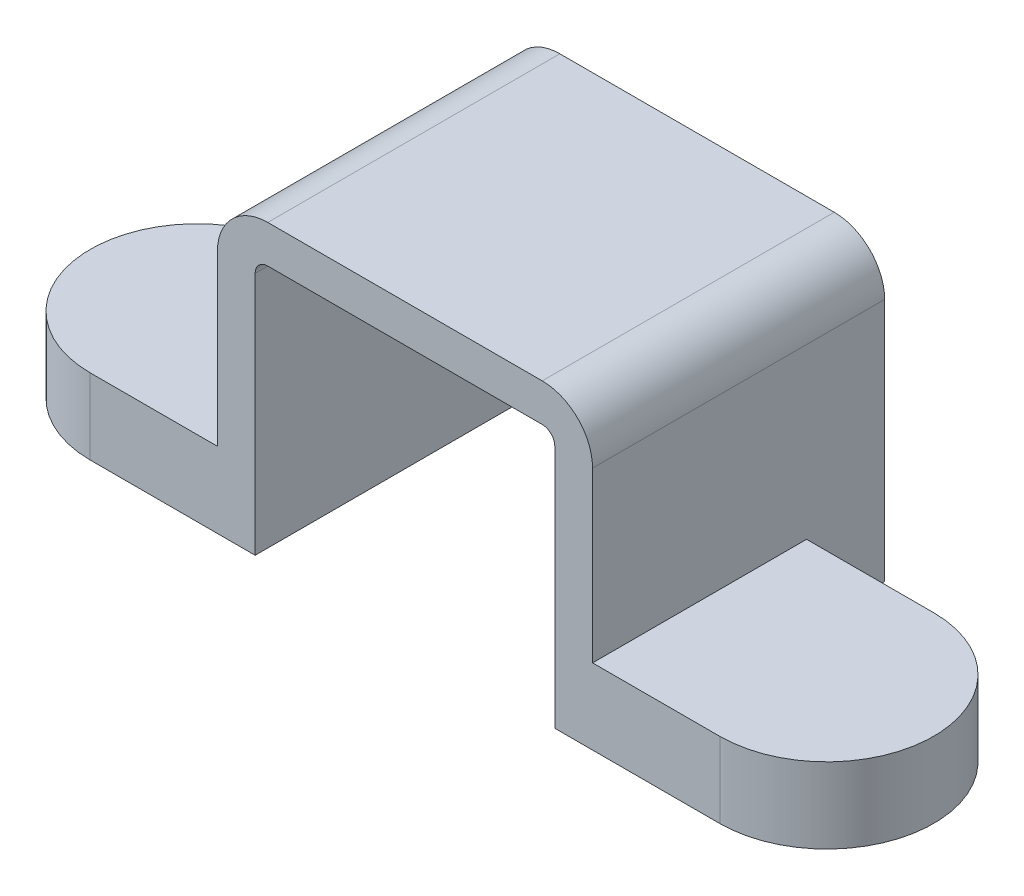
ISO-10303-21;
HEADER;
FILE_DESCRIPTION(('STEP AP214'),'2;1');
FILE_NAME('part.step','',(''),(''),'','','');
FILE_SCHEMA(('AUTOMOTIVE_DESIGN { 1 0 10303 214 1 1 1 1 }'));
ENDSEC;
DATA;
#1=APPLICATION_CONTEXT('core data for automotive mechanical design processes');
#2=APPLICATION_PROTOCOL_DEFINITION('international standard','automotive_design',2000,#1);
#3=PRODUCT_CONTEXT('',#1,'mechanical');
#4=PRODUCT('Part','Part','',(#3));
#5=PRODUCT_RELATED_PRODUCT_CATEGORY('part','',(#4));
#6=PRODUCT_DEFINITION_FORMATION('','',#4);
#7=PRODUCT_DEFINITION_CONTEXT('part definition',#1,'design');
#8=PRODUCT_DEFINITION('design','',#6,#7);
#9=PRODUCT_DEFINITION_SHAPE('','',#8);
#10=(LENGTH_UNIT() NAMED_UNIT(*) SI_UNIT(.MILLI.,.METRE.));
#11=(NAMED_UNIT(*) PLANE_ANGLE_UNIT() SI_UNIT($,.RADIAN.));
#12=(NAMED_UNIT(*) SI_UNIT($,.STERADIAN.) SOLID_ANGLE_UNIT());
#13=UNCERTAINTY_MEASURE_WITH_UNIT(LENGTH_MEASURE(1.E-05),#10,'distance_accuracy_value','');
#14=(GEOMETRIC_REPRESENTATION_CONTEXT(3) GLOBAL_UNCERTAINTY_ASSIGNED_CONTEXT((#13)) GLOBAL_UNIT_ASSIGNED_CONTEXT((#10,
#11,#12)) REPRESENTATION_CONTEXT('',''));
#15=CARTESIAN_POINT('',(0.,0.,0.));
#16=DIRECTION('',(0.,0.,1.));
#17=DIRECTION('',(1.,0.,0.));
#18=AXIS2_PLACEMENT_3D('',#15,#16,#17);
#19=CARTESIAN_POINT('',(7.45,0.,3.10000190177653));
#20=DIRECTION('',(0.,0.,1.));
#21=DIRECTION('',(1.,0.,0.));
#22=AXIS2_PLACEMENT_3D('',#19,#20,#21);
#23=PLANE('',#22);
#24=DIRECTION('',(0.,1.,0.));
#25=VECTOR('',#24,1.);
#26=CARTESIAN_POINT('',(7.45,0.,3.10000190177653));
#27=LINE('',#26,#25);
#28=CARTESIAN_POINT('',(7.45,3.,3.10000190177653));
#29=VERTEX_POINT('',#28);
#30=CARTESIAN_POINT('',(7.45,0.,3.10000190177653));
#31=VERTEX_POINT('',#30);
#32=EDGE_CURVE('E153',#29,#31,#27,.F.);
#33=ORIENTED_EDGE('',*,*,#32,.F.);
#34=DIRECTION('',(1.,0.,0.));
#35=VECTOR('',#34,1.);
#36=CARTESIAN_POINT('',(12.1,3.,3.10000190177653));
#37=LINE('',#36,#35);
#38=CARTESIAN_POINT('',(12.5,3.,3.10000190177653));
#39=VERTEX_POINT('',#38);
#40=EDGE_CURVE('E148',#39,#29,#37,.F.);
#41=ORIENTED_EDGE('',*,*,#40,.F.);
#42=DIRECTION('',(0.,-1.,0.));
#43=VECTOR('',#42,1.);
#44=CARTESIAN_POINT('',(12.5,0.,3.10000190177653));
#45=LINE('',#44,#43);
#46=CARTESIAN_POINT('',(12.5,0.,3.10000190177653));
#47=VERTEX_POINT('',#46);
#48=EDGE_CURVE('E169',#47,#39,#45,.F.);
#49=ORIENTED_EDGE('',*,*,#48,.F.);
#50=DIRECTION('',(1.,0.,0.));
#51=VECTOR('',#50,1.);
#52=CARTESIAN_POINT('',(-7.45,0.,3.10000190177653));
#53=LINE('',#52,#51);
#54=EDGE_CURVE('E168',#31,#47,#53,.T.);
#55=ORIENTED_EDGE('',*,*,#54,.F.);
#56=EDGE_LOOP('',(#33,#41,#49,#55));
#57=FACE_BOUND('',#56,.T.);
#58=ADVANCED_FACE('F17',(#57),#23,.F.);
#59=CARTESIAN_POINT('',(-7.45,0.,3.10000190177653));
#60=DIRECTION('',(0.,0.,-1.));
#61=DIRECTION('',(-1.,0.,0.));
#62=AXIS2_PLACEMENT_3D('',#59,#60,#61);
#63=PLANE('',#62);
#64=DIRECTION('',(1.,0.,0.));
#65=VECTOR('',#64,1.);
#66=CARTESIAN_POINT('',(-12.1,3.,3.10000190177653));
#67=LINE('',#66,#65);
#68=CARTESIAN_POINT('',(-12.5,3.,3.10000190177653));
#69=VERTEX_POINT('',#68);
#70=CARTESIAN_POINT('',(-7.45,3.,3.10000190177653));
#71=VERTEX_POINT('',#70);
#72=EDGE_CURVE('E258',#69,#71,#67,.T.);
#73=ORIENTED_EDGE('',*,*,#72,.T.);
#74=DIRECTION('',(0.,-1.,0.));
#75=VECTOR('',#74,1.);
#76=CARTESIAN_POINT('',(-7.45,11.7,3.10000190177653));
#77=LINE('',#76,#75);
#78=CARTESIAN_POINT('',(-7.45,0.,3.10000190177653));
#79=VERTEX_POINT('',#78);
#80=EDGE_CURVE('E197',#79,#71,#77,.F.);
#81=ORIENTED_EDGE('',*,*,#80,.F.);
#82=DIRECTION('',(1.,0.,0.));
#83=VECTOR('',#82,1.);
#84=CARTESIAN_POINT('',(-7.45,0.,3.10000190177653));
#85=LINE('',#84,#83);
#86=CARTESIAN_POINT('',(-12.5,0.,3.10000190177653));
#87=VERTEX_POINT('',#86);
#88=EDGE_CURVE('E255',#87,#79,#85,.T.);
#89=ORIENTED_EDGE('',*,*,#88,.F.);
#90=DIRECTION('',(0.,1.,0.));
#91=VECTOR('',#90,1.);
#92=CARTESIAN_POINT('',(-12.5,0.,3.10000190177653));
#93=LINE('',#92,#91);
#94=EDGE_CURVE('E204',#69,#87,#93,.F.);
#95=ORIENTED_EDGE('',*,*,#94,.F.);
#96=EDGE_LOOP('',(#73,#81,#89,#95));
#97=FACE_BOUND('',#96,.T.);
#98=ADVANCED_FACE('F414',(#97),#63,.T.);
#99=CARTESIAN_POINT('',(-5.95,11.7,0.));
#100=DIRECTION('',(-1.,0.,0.));
#101=DIRECTION('',(0.,-1.,0.));
#102=AXIS2_PLACEMENT_3D('',#99,#100,#101);
#103=PLANE('',#102);
#104=DIRECTION('',(0.,1.,0.));
#105=VECTOR('',#104,1.);
#106=CARTESIAN_POINT('',(-5.95,5.85,11.6));
#107=LINE('',#106,#105);
#108=CARTESIAN_POINT('',(-5.95,0.,11.6));
#109=VERTEX_POINT('',#108);
#110=CARTESIAN_POINT('',(-5.95,9.7,11.6));
#111=VERTEX_POINT('',#110);
#112=EDGE_CURVE('E234',#109,#111,#107,.T.);
#113=ORIENTED_EDGE('',*,*,#112,.F.);
#114=DIRECTION('',(0.,0.,-1.));
#115=VECTOR('',#114,1.);
#116=CARTESIAN_POINT('',(-5.95,0.,0.));
#117=LINE('',#116,#115);
#118=CARTESIAN_POINT('',(-5.95,0.,0.));
#119=VERTEX_POINT('',#118);
#120=EDGE_CURVE('E206',#119,#109,#117,.F.);
#121=ORIENTED_EDGE('',*,*,#120,.F.);
#122=DIRECTION('',(0.,1.,0.));
#123=VECTOR('',#122,1.);
#124=CARTESIAN_POINT('',(-5.95,5.85,0.));
#125=LINE('',#124,#123);
#126=CARTESIAN_POINT('',(-5.95,9.7,0.));
#127=VERTEX_POINT('',#126);
#128=EDGE_CURVE('E240',#119,#127,#125,.T.);
#129=ORIENTED_EDGE('',*,*,#128,.T.);
#130=DIRECTION('',(0.,0.,1.));
#131=VECTOR('',#130,1.);
#132=CARTESIAN_POINT('',(-5.95,9.7,0.));
#133=LINE('',#132,#131);
#134=EDGE_CURVE('E239',#127,#111,#133,.T.);
#135=ORIENTED_EDGE('',*,*,#134,.T.);
#136=EDGE_LOOP('',(#113,#121,#129,#135));
#137=FACE_BOUND('',#136,.T.);
#138=ADVANCED_FACE('F412',(#137),#103,.F.);
#139=CARTESIAN_POINT('',(-7.45,0.,0.));
#140=DIRECTION('',(0.,-1.,0.));
#141=DIRECTION('',(0.,0.,-1.));
#142=AXIS2_PLACEMENT_3D('',#139,#140,#141);
#143=PLANE('',#142);
#144=CARTESIAN_POINT('',(12.5,0.,7.35000190177653));
#145=DIRECTION('',(0.,-1.,0.));
#146=DIRECTION('',(0.,0.,-1.));
#147=AXIS2_PLACEMENT_3D('',#144,#145,#146);
#148=CIRCLE('',#147,4.25);
#149=CARTESIAN_POINT('',(12.5040205841539,0.,11.6));
#150=VERTEX_POINT('',#149);
#151=EDGE_CURVE('E20',#150,#47,#148,.F.);
#152=ORIENTED_EDGE('',*,*,#151,.F.);
#153=DIRECTION('',(1.,0.,0.));
#154=VECTOR('',#153,1.);
#155=CARTESIAN_POINT('',(0.,0.,11.6));
#156=LINE('',#155,#154);
#157=CARTESIAN_POINT('',(5.95,0.,11.6));
#158=VERTEX_POINT('',#157);
#159=EDGE_CURVE('E116',#158,#150,#156,.T.);
#160=ORIENTED_EDGE('',*,*,#159,.F.);
#161=DIRECTION('',(0.,0.,1.));
#162=VECTOR('',#161,1.);
#163=CARTESIAN_POINT('',(5.95,0.,0.));
#164=LINE('',#163,#162);
#165=CARTESIAN_POINT('',(5.95,0.,0.));
#166=VERTEX_POINT('',#165);
#167=EDGE_CURVE('E124',#158,#166,#164,.F.);
#168=ORIENTED_EDGE('',*,*,#167,.T.);
#169=DIRECTION('',(1.,0.,0.));
#170=VECTOR('',#169,1.);
#171=CARTESIAN_POINT('',(0.,0.,0.));
#172=LINE('',#171,#170);
#173=CARTESIAN_POINT('',(7.45,0.,0.));
#174=VERTEX_POINT('',#173);
#175=EDGE_CURVE('E177',#166,#174,#172,.T.);
#176=ORIENTED_EDGE('',*,*,#175,.T.);
#177=DIRECTION('',(0.,0.,1.));
#178=VECTOR('',#177,1.);
#179=CARTESIAN_POINT('',(7.45,0.,0.));
#180=LINE('',#179,#178);
#181=EDGE_CURVE('E159',#31,#174,#180,.F.);
#182=ORIENTED_EDGE('',*,*,#181,.F.);
#183=ORIENTED_EDGE('',*,*,#54,.T.);
#184=EDGE_LOOP('',(#152,#160,#168,#176,#182,#183));
#185=FACE_BOUND('',#184,.T.);
#186=ADVANCED_FACE('F175',(#185),#143,.T.);
#187=CARTESIAN_POINT('',(12.5,0.,7.35000190177653));
#188=DIRECTION('',(0.,-1.,0.));
#189=DIRECTION('',(0.,0.,-1.));
#190=AXIS2_PLACEMENT_3D('',#187,#188,#189);
#191=CYLINDRICAL_SURFACE('',#190,4.25);
#192=CARTESIAN_POINT('',(12.5,3.,7.35000190177653));
#193=DIRECTION('',(0.,-1.,0.));
#194=DIRECTION('',(0.,0.,-1.));
#195=AXIS2_PLACEMENT_3D('',#192,#193,#194);
#196=CIRCLE('',#195,4.25);
#197=CARTESIAN_POINT('',(12.5040205841539,3.,11.6));
#198=VERTEX_POINT('',#197);
#199=EDGE_CURVE('E259',#198,#39,#196,.F.);
#200=ORIENTED_EDGE('',*,*,#199,.F.);
#201=DIRECTION('',(0.,1.,0.));
#202=VECTOR('',#201,1.);
#203=CARTESIAN_POINT('',(12.5040205841539,5.85,11.6));
#204=LINE('',#203,#202);
#205=EDGE_CURVE('E273',#150,#198,#204,.T.);
#206=ORIENTED_EDGE('',*,*,#205,.F.);
#207=ORIENTED_EDGE('',*,*,#151,.T.);
#208=ORIENTED_EDGE('',*,*,#48,.T.);
#209=EDGE_LOOP('',(#200,#206,#207,#208));
#210=FACE_BOUND('',#209,.T.);
#211=ADVANCED_FACE('F421',(#210),#191,.T.);
#212=CARTESIAN_POINT('',(12.1,3.,7.35000095088827));
#213=DIRECTION('',(0.,1.,0.));
#214=DIRECTION('',(0.,0.,1.));
#215=AXIS2_PLACEMENT_3D('',#212,#213,#214);
#216=PLANE('',#215);
#217=DIRECTION('',(1.,0.,0.));
#218=VECTOR('',#217,1.);
#219=CARTESIAN_POINT('',(0.,3.,11.6));
#220=LINE('',#219,#218);
#221=CARTESIAN_POINT('',(7.45,3.,11.6));
#222=VERTEX_POINT('',#221);
#223=EDGE_CURVE('E276',#198,#222,#220,.F.);
#224=ORIENTED_EDGE('',*,*,#223,.F.);
#225=ORIENTED_EDGE('',*,*,#199,.T.);
#226=ORIENTED_EDGE('',*,*,#40,.T.);
#227=DIRECTION('',(0.,0.,1.));
#228=VECTOR('',#227,1.);
#229=CARTESIAN_POINT('',(7.45,3.,0.));
#230=LINE('',#229,#228);
#231=EDGE_CURVE('E162',#222,#29,#230,.F.);
#232=ORIENTED_EDGE('',*,*,#231,.F.);
#233=EDGE_LOOP('',(#224,#225,#226,#232));
#234=FACE_BOUND('',#233,.T.);
#235=ADVANCED_FACE('F467',(#234),#216,.T.);
#236=CARTESIAN_POINT('',(7.45,0.,0.));
#237=DIRECTION('',(1.,0.,0.));
#238=DIRECTION('',(0.,1.,0.));
#239=AXIS2_PLACEMENT_3D('',#236,#237,#238);
#240=PLANE('',#239);
#241=DIRECTION('',(0.,0.,1.));
#242=VECTOR('',#241,1.);
#243=CARTESIAN_POINT('',(7.45,9.7,0.));
#244=LINE('',#243,#242);
#245=CARTESIAN_POINT('',(7.45,9.7,11.6));
#246=VERTEX_POINT('',#245);
#247=CARTESIAN_POINT('',(7.45,9.7,0.));
#248=VERTEX_POINT('',#247);
#249=EDGE_CURVE('E179',#246,#248,#244,.F.);
#250=ORIENTED_EDGE('',*,*,#249,.F.);
#251=DIRECTION('',(0.,1.,0.));
#252=VECTOR('',#251,1.);
#253=CARTESIAN_POINT('',(7.45,5.85,11.6));
#254=LINE('',#253,#252);
#255=EDGE_CURVE('E229',#222,#246,#254,.T.);
#256=ORIENTED_EDGE('',*,*,#255,.F.);
#257=ORIENTED_EDGE('',*,*,#231,.T.);
#258=ORIENTED_EDGE('',*,*,#32,.T.);
#259=ORIENTED_EDGE('',*,*,#181,.T.);
#260=DIRECTION('',(0.,1.,0.));
#261=VECTOR('',#260,1.);
#262=CARTESIAN_POINT('',(7.45,5.85,0.));
#263=LINE('',#262,#261);
#264=EDGE_CURVE('E193',#174,#248,#263,.T.);
#265=ORIENTED_EDGE('',*,*,#264,.T.);
#266=EDGE_LOOP('',(#250,#256,#257,#258,#259,#265));
#267=FACE_BOUND('',#266,.T.);
#268=ADVANCED_FACE('F156',(#267),#240,.T.);
#269=CARTESIAN_POINT('',(5.45,9.7,0.));
#270=DIRECTION('',(0.,0.,1.));
#271=DIRECTION('',(1.,0.,0.));
#272=AXIS2_PLACEMENT_3D('',#269,#270,#271);
#273=CYLINDRICAL_SURFACE('',#272,2.);
#274=CARTESIAN_POINT('',(5.45,9.7,0.));
#275=DIRECTION('',(0.,0.,1.));
#276=DIRECTION('',(1.,0.,0.));
#277=AXIS2_PLACEMENT_3D('',#274,#275,#276);
#278=CIRCLE('',#277,2.);
#279=CARTESIAN_POINT('',(5.45,11.7,0.));
#280=VERTEX_POINT('',#279);
#281=EDGE_CURVE('E247',#248,#280,#278,.T.);
#282=ORIENTED_EDGE('',*,*,#281,.T.);
#283=DIRECTION('',(0.,0.,1.));
#284=VECTOR('',#283,1.);
#285=CARTESIAN_POINT('',(5.45,11.7,0.));
#286=LINE('',#285,#284);
#287=CARTESIAN_POINT('',(5.45,11.7,11.6));
#288=VERTEX_POINT('',#287);
#289=EDGE_CURVE('E183',#288,#280,#286,.F.);
#290=ORIENTED_EDGE('',*,*,#289,.F.);
#291=CARTESIAN_POINT('',(5.45,9.7,11.6));
#292=DIRECTION('',(0.,0.,1.));
#293=DIRECTION('',(1.,0.,0.));
#294=AXIS2_PLACEMENT_3D('',#291,#292,#293);
#295=CIRCLE('',#294,2.);
#296=EDGE_CURVE('E226',#246,#288,#295,.T.);
#297=ORIENTED_EDGE('',*,*,#296,.F.);
#298=ORIENTED_EDGE('',*,*,#249,.T.);
#299=EDGE_LOOP('',(#282,#290,#297,#298));
#300=FACE_BOUND('',#299,.T.);
#301=ADVANCED_FACE('F460',(#300),#273,.T.);
#302=CARTESIAN_POINT('',(7.45,11.7,0.));
#303=DIRECTION('',(0.,1.,0.));
#304=DIRECTION('',(0.,0.,1.));
#305=AXIS2_PLACEMENT_3D('',#302,#303,#304);
#306=PLANE('',#305);
#307=DIRECTION('',(0.,0.,1.));
#308=VECTOR('',#307,1.);
#309=CARTESIAN_POINT('',(-5.45,11.7,0.));
#310=LINE('',#309,#308);
#311=CARTESIAN_POINT('',(-5.45,11.7,11.6));
#312=VERTEX_POINT('',#311);
#313=CARTESIAN_POINT('',(-5.45,11.7,0.));
#314=VERTEX_POINT('',#313);
#315=EDGE_CURVE('E339',#312,#314,#310,.F.);
#316=ORIENTED_EDGE('',*,*,#315,.F.);
#317=DIRECTION('',(1.,0.,0.));
#318=VECTOR('',#317,1.);
#319=CARTESIAN_POINT('',(0.,11.7,11.6));
#320=LINE('',#319,#318);
#321=EDGE_CURVE('E225',#288,#312,#320,.F.);
#322=ORIENTED_EDGE('',*,*,#321,.F.);
#323=ORIENTED_EDGE('',*,*,#289,.T.);
#324=DIRECTION('',(1.,0.,0.));
#325=VECTOR('',#324,1.);
#326=CARTESIAN_POINT('',(0.,11.7,0.));
#327=LINE('',#326,#325);
#328=EDGE_CURVE('E246',#280,#314,#327,.F.);
#329=ORIENTED_EDGE('',*,*,#328,.T.);
#330=EDGE_LOOP('',(#316,#322,#323,#329));
#331=FACE_BOUND('',#330,.T.);
#332=ADVANCED_FACE('F456',(#331),#306,.T.);
#333=CARTESIAN_POINT('',(-5.45,9.7,0.));
#334=DIRECTION('',(0.,0.,1.));
#335=DIRECTION('',(1.,0.,0.));
#336=AXIS2_PLACEMENT_3D('',#333,#334,#335);
#337=CYLINDRICAL_SURFACE('',#336,2.);
#338=CARTESIAN_POINT('',(-5.45,9.7,0.));
#339=DIRECTION('',(0.,0.,1.));
#340=DIRECTION('',(1.,0.,0.));
#341=AXIS2_PLACEMENT_3D('',#338,#339,#340);
#342=CIRCLE('',#341,2.);
#343=CARTESIAN_POINT('',(-7.45,9.7,0.));
#344=VERTEX_POINT('',#343);
#345=EDGE_CURVE('E241',#314,#344,#342,.T.);
#346=ORIENTED_EDGE('',*,*,#345,.T.);
#347=DIRECTION('',(0.,0.,1.));
#348=VECTOR('',#347,1.);
#349=CARTESIAN_POINT('',(-7.45,9.7,0.));
#350=LINE('',#349,#348);
#351=CARTESIAN_POINT('',(-7.45,9.7,11.6));
#352=VERTEX_POINT('',#351);
#353=EDGE_CURVE('E201',#352,#344,#350,.F.);
#354=ORIENTED_EDGE('',*,*,#353,.F.);
#355=CARTESIAN_POINT('',(-5.45,9.7,11.6));
#356=DIRECTION('',(0.,0.,1.));
#357=DIRECTION('',(1.,0.,0.));
#358=AXIS2_PLACEMENT_3D('',#355,#356,#357);
#359=CIRCLE('',#358,2.);
#360=EDGE_CURVE('E221',#312,#352,#359,.T.);
#361=ORIENTED_EDGE('',*,*,#360,.F.);
#362=ORIENTED_EDGE('',*,*,#315,.T.);
#363=EDGE_LOOP('',(#346,#354,#361,#362));
#364=FACE_BOUND('',#363,.T.);
#365=ADVANCED_FACE('F452',(#364),#337,.T.);
#366=CARTESIAN_POINT('',(-7.45,11.7,0.));
#367=DIRECTION('',(-1.,0.,0.));
#368=DIRECTION('',(0.,-1.,0.));
#369=AXIS2_PLACEMENT_3D('',#366,#367,#368);
#370=PLANE('',#369);
#371=DIRECTION('',(0.,0.,-1.));
#372=VECTOR('',#371,1.);
#373=CARTESIAN_POINT('',(-7.45,0.,0.));
#374=LINE('',#373,#372);
#375=CARTESIAN_POINT('',(-7.45,0.,0.));
#376=VERTEX_POINT('',#375);
#377=EDGE_CURVE('E285',#79,#376,#374,.T.);
#378=ORIENTED_EDGE('',*,*,#377,.F.);
#379=ORIENTED_EDGE('',*,*,#80,.T.);
#380=DIRECTION('',(0.,0.,-1.));
#381=VECTOR('',#380,1.);
#382=CARTESIAN_POINT('',(-7.45,3.,7.35000095088827));
#383=LINE('',#382,#381);
#384=CARTESIAN_POINT('',(-7.45,3.,11.6));
#385=VERTEX_POINT('',#384);
#386=EDGE_CURVE('E200',#71,#385,#383,.F.);
#387=ORIENTED_EDGE('',*,*,#386,.T.);
#388=DIRECTION('',(0.,1.,0.));
#389=VECTOR('',#388,1.);
#390=CARTESIAN_POINT('',(-7.45,5.85,11.6));
#391=LINE('',#390,#389);
#392=EDGE_CURVE('E224',#352,#385,#391,.F.);
#393=ORIENTED_EDGE('',*,*,#392,.F.);
#394=ORIENTED_EDGE('',*,*,#353,.T.);
#395=DIRECTION('',(0.,1.,0.));
#396=VECTOR('',#395,1.);
#397=CARTESIAN_POINT('',(-7.45,5.85,0.));
#398=LINE('',#397,#396);
#399=EDGE_CURVE('E245',#344,#376,#398,.F.);
#400=ORIENTED_EDGE('',*,*,#399,.T.);
#401=EDGE_LOOP('',(#378,#379,#387,#393,#394,#400));
#402=FACE_BOUND('',#401,.T.);
#403=ADVANCED_FACE('F448',(#402),#370,.T.);
#404=CARTESIAN_POINT('',(-12.1,3.,7.35000095088827));
#405=DIRECTION('',(0.,-1.,0.));
#406=DIRECTION('',(0.,0.,-1.));
#407=AXIS2_PLACEMENT_3D('',#404,#405,#406);
#408=PLANE('',#407);
#409=CARTESIAN_POINT('',(-12.5,3.,7.35000190177653));
#410=DIRECTION('',(0.,1.,0.));
#411=DIRECTION('',(0.,0.,1.));
#412=AXIS2_PLACEMENT_3D('',#409,#410,#411);
#413=CIRCLE('',#412,4.25);
#414=CARTESIAN_POINT('',(-12.5040205841539,3.,11.6));
#415=VERTEX_POINT('',#414);
#416=EDGE_CURVE('E207',#415,#69,#413,.F.);
#417=ORIENTED_EDGE('',*,*,#416,.F.);
#418=DIRECTION('',(1.,0.,0.));
#419=VECTOR('',#418,1.);
#420=CARTESIAN_POINT('',(0.,3.,11.6));
#421=LINE('',#420,#419);
#422=EDGE_CURVE('E313',#385,#415,#421,.F.);
#423=ORIENTED_EDGE('',*,*,#422,.F.);
#424=ORIENTED_EDGE('',*,*,#386,.F.);
#425=ORIENTED_EDGE('',*,*,#72,.F.);
#426=EDGE_LOOP('',(#417,#423,#424,#425));
#427=FACE_BOUND('',#426,.T.);
#428=ADVANCED_FACE('F444',(#427),#408,.F.);
#429=CARTESIAN_POINT('',(-12.5,0.,7.35000190177653));
#430=DIRECTION('',(0.,1.,0.));
#431=DIRECTION('',(0.,0.,1.));
#432=AXIS2_PLACEMENT_3D('',#429,#430,#431);
#433=CYLINDRICAL_SURFACE('',#432,4.25);
#434=ORIENTED_EDGE('',*,*,#416,.T.);
#435=ORIENTED_EDGE('',*,*,#94,.T.);
#436=CARTESIAN_POINT('',(-12.5,0.,7.35000190177653));
#437=DIRECTION('',(0.,1.,0.));
#438=DIRECTION('',(0.,0.,1.));
#439=AXIS2_PLACEMENT_3D('',#436,#437,#438);
#440=CIRCLE('',#439,4.25);
#441=CARTESIAN_POINT('',(-12.5040205841539,0.,11.6));
#442=VERTEX_POINT('',#441);
#443=EDGE_CURVE('E251',#442,#87,#440,.F.);
#444=ORIENTED_EDGE('',*,*,#443,.F.);
#445=DIRECTION('',(0.,1.,0.));
#446=VECTOR('',#445,1.);
#447=CARTESIAN_POINT('',(-12.5040205841539,5.85,11.6));
#448=LINE('',#447,#446);
#449=EDGE_CURVE('E309',#415,#442,#448,.F.);
#450=ORIENTED_EDGE('',*,*,#449,.F.);
#451=EDGE_LOOP('',(#434,#435,#444,#450));
#452=FACE_BOUND('',#451,.T.);
#453=ADVANCED_FACE('F441',(#452),#433,.T.);
#454=CARTESIAN_POINT('',(-7.45,0.,0.));
#455=DIRECTION('',(0.,-1.,0.));
#456=DIRECTION('',(0.,0.,-1.));
#457=AXIS2_PLACEMENT_3D('',#454,#455,#456);
#458=PLANE('',#457);
#459=ORIENTED_EDGE('',*,*,#377,.T.);
#460=DIRECTION('',(1.,0.,0.));
#461=VECTOR('',#460,1.);
#462=CARTESIAN_POINT('',(0.,0.,0.));
#463=LINE('',#462,#461);
#464=EDGE_CURVE('E291',#376,#119,#463,.T.);
#465=ORIENTED_EDGE('',*,*,#464,.T.);
#466=ORIENTED_EDGE('',*,*,#120,.T.);
#467=DIRECTION('',(1.,0.,0.));
#468=VECTOR('',#467,1.);
#469=CARTESIAN_POINT('',(0.,0.,11.6));
#470=LINE('',#469,#468);
#471=EDGE_CURVE('E312',#442,#109,#470,.T.);
#472=ORIENTED_EDGE('',*,*,#471,.F.);
#473=ORIENTED_EDGE('',*,*,#443,.T.);
#474=ORIENTED_EDGE('',*,*,#88,.T.);
#475=EDGE_LOOP('',(#459,#465,#466,#472,#473,#474));
#476=FACE_BOUND('',#475,.T.);
#477=ADVANCED_FACE('F408',(#476),#458,.T.);
#478=CARTESIAN_POINT('',(5.95,0.,0.));
#479=DIRECTION('',(1.,0.,0.));
#480=DIRECTION('',(0.,1.,0.));
#481=AXIS2_PLACEMENT_3D('',#478,#479,#480);
#482=PLANE('',#481);
#483=DIRECTION('',(0.,1.,0.));
#484=VECTOR('',#483,1.);
#485=CARTESIAN_POINT('',(5.95,5.85,0.));
#486=LINE('',#485,#484);
#487=CARTESIAN_POINT('',(5.95,9.7,0.));
#488=VERTEX_POINT('',#487);
#489=EDGE_CURVE('E194',#488,#166,#486,.F.);
#490=ORIENTED_EDGE('',*,*,#489,.T.);
#491=ORIENTED_EDGE('',*,*,#167,.F.);
#492=DIRECTION('',(0.,1.,0.));
#493=VECTOR('',#492,1.);
#494=CARTESIAN_POINT('',(5.95,5.85,11.6));
#495=LINE('',#494,#493);
#496=CARTESIAN_POINT('',(5.95,9.7,11.6));
#497=VERTEX_POINT('',#496);
#498=EDGE_CURVE('E233',#497,#158,#495,.F.);
#499=ORIENTED_EDGE('',*,*,#498,.F.);
#500=DIRECTION('',(0.,0.,1.));
#501=VECTOR('',#500,1.);
#502=CARTESIAN_POINT('',(5.95,9.7,0.));
#503=LINE('',#502,#501);
#504=EDGE_CURVE('E220',#497,#488,#503,.F.);
#505=ORIENTED_EDGE('',*,*,#504,.T.);
#506=EDGE_LOOP('',(#490,#491,#499,#505));
#507=FACE_BOUND('',#506,.T.);
#508=ADVANCED_FACE('F390',(#507),#482,.F.);
#509=CARTESIAN_POINT('',(0.,5.85,0.));
#510=DIRECTION('',(0.,0.,1.));
#511=DIRECTION('',(1.,0.,0.));
#512=AXIS2_PLACEMENT_3D('',#509,#510,#511);
#513=PLANE('',#512);
#514=ORIENTED_EDGE('',*,*,#464,.F.);
#515=ORIENTED_EDGE('',*,*,#399,.F.);
#516=ORIENTED_EDGE('',*,*,#345,.F.);
#517=ORIENTED_EDGE('',*,*,#328,.F.);
#518=ORIENTED_EDGE('',*,*,#281,.F.);
#519=ORIENTED_EDGE('',*,*,#264,.F.);
#520=ORIENTED_EDGE('',*,*,#175,.F.);
#521=ORIENTED_EDGE('',*,*,#489,.F.);
#522=CARTESIAN_POINT('',(5.45,9.7,0.));
#523=DIRECTION('',(0.,0.,1.));
#524=DIRECTION('',(1.,0.,0.));
#525=AXIS2_PLACEMENT_3D('',#522,#523,#524);
#526=CIRCLE('',#525,0.5);
#527=CARTESIAN_POINT('',(5.45,10.2,0.));
#528=VERTEX_POINT('',#527);
#529=EDGE_CURVE('E216',#488,#528,#526,.T.);
#530=ORIENTED_EDGE('',*,*,#529,.T.);
#531=DIRECTION('',(1.,0.,0.));
#532=VECTOR('',#531,1.);
#533=CARTESIAN_POINT('',(7.45,10.2,0.));
#534=LINE('',#533,#532);
#535=CARTESIAN_POINT('',(-5.45,10.2,0.));
#536=VERTEX_POINT('',#535);
#537=EDGE_CURVE('E215',#528,#536,#534,.F.);
#538=ORIENTED_EDGE('',*,*,#537,.T.);
#539=CARTESIAN_POINT('',(-5.45,9.7,0.));
#540=DIRECTION('',(0.,0.,1.));
#541=DIRECTION('',(1.,0.,0.));
#542=AXIS2_PLACEMENT_3D('',#539,#540,#541);
#543=CIRCLE('',#542,0.5);
#544=EDGE_CURVE('E235',#536,#127,#543,.T.);
#545=ORIENTED_EDGE('',*,*,#544,.T.);
#546=ORIENTED_EDGE('',*,*,#128,.F.);
#547=EDGE_LOOP('',(#514,#515,#516,#517,#518,#519,#520,#521,#530,#538,#545,#546));
#548=FACE_BOUND('',#547,.T.);
#549=ADVANCED_FACE('F393',(#548),#513,.F.);
#550=CARTESIAN_POINT('',(-5.45,9.7,0.));
#551=DIRECTION('',(0.,0.,1.));
#552=DIRECTION('',(1.,0.,0.));
#553=AXIS2_PLACEMENT_3D('',#550,#551,#552);
#554=CYLINDRICAL_SURFACE('',#553,0.5);
#555=ORIENTED_EDGE('',*,*,#134,.F.);
#556=ORIENTED_EDGE('',*,*,#544,.F.);
#557=DIRECTION('',(0.,0.,1.));
#558=VECTOR('',#557,1.);
#559=CARTESIAN_POINT('',(-5.45,10.2,0.));
#560=LINE('',#559,#558);
#561=CARTESIAN_POINT('',(-5.45,10.2,11.6));
#562=VERTEX_POINT('',#561);
#563=EDGE_CURVE('E361',#536,#562,#560,.T.);
#564=ORIENTED_EDGE('',*,*,#563,.T.);
#565=CARTESIAN_POINT('',(-5.45,9.7,11.6));
#566=DIRECTION('',(0.,0.,1.));
#567=DIRECTION('',(1.,0.,0.));
#568=AXIS2_PLACEMENT_3D('',#565,#566,#567);
#569=CIRCLE('',#568,0.5);
#570=EDGE_CURVE('E230',#111,#562,#569,.F.);
#571=ORIENTED_EDGE('',*,*,#570,.F.);
#572=EDGE_LOOP('',(#555,#556,#564,#571));
#573=FACE_BOUND('',#572,.T.);
#574=ADVANCED_FACE('F404',(#573),#554,.F.);
#575=CARTESIAN_POINT('',(0.,5.85,11.6));
#576=DIRECTION('',(0.,0.,1.));
#577=DIRECTION('',(1.,0.,0.));
#578=AXIS2_PLACEMENT_3D('',#575,#576,#577);
#579=PLANE('',#578);
#580=ORIENTED_EDGE('',*,*,#449,.T.);
#581=ORIENTED_EDGE('',*,*,#471,.T.);
#582=ORIENTED_EDGE('',*,*,#112,.T.);
#583=ORIENTED_EDGE('',*,*,#570,.T.);
#584=DIRECTION('',(1.,0.,0.));
#585=VECTOR('',#584,1.);
#586=CARTESIAN_POINT('',(7.45,10.2,11.6));
#587=LINE('',#586,#585);
#588=CARTESIAN_POINT('',(5.45,10.2,11.6));
#589=VERTEX_POINT('',#588);
#590=EDGE_CURVE('E27',#562,#589,#587,.T.);
#591=ORIENTED_EDGE('',*,*,#590,.T.);
#592=CARTESIAN_POINT('',(5.45,9.7,11.6));
#593=DIRECTION('',(0.,0.,1.));
#594=DIRECTION('',(1.,0.,0.));
#595=AXIS2_PLACEMENT_3D('',#592,#593,#594);
#596=CIRCLE('',#595,0.5);
#597=EDGE_CURVE('E35',#589,#497,#596,.F.);
#598=ORIENTED_EDGE('',*,*,#597,.T.);
#599=ORIENTED_EDGE('',*,*,#498,.T.);
#600=ORIENTED_EDGE('',*,*,#159,.T.);
#601=ORIENTED_EDGE('',*,*,#205,.T.);
#602=ORIENTED_EDGE('',*,*,#223,.T.);
#603=ORIENTED_EDGE('',*,*,#255,.T.);
#604=ORIENTED_EDGE('',*,*,#296,.T.);
#605=ORIENTED_EDGE('',*,*,#321,.T.);
#606=ORIENTED_EDGE('',*,*,#360,.T.);
#607=ORIENTED_EDGE('',*,*,#392,.T.);
#608=ORIENTED_EDGE('',*,*,#422,.T.);
#609=EDGE_LOOP('',(#580,#581,#582,#583,#591,#598,#599,#600,#601,#602,#603,#604,#605,#606,#607,#608));
#610=FACE_BOUND('',#609,.T.);
#611=ADVANCED_FACE('F399',(#610),#579,.T.);
#612=CARTESIAN_POINT('',(5.45,9.7,0.));
#613=DIRECTION('',(0.,0.,1.));
#614=DIRECTION('',(1.,0.,0.));
#615=AXIS2_PLACEMENT_3D('',#612,#613,#614);
#616=CYLINDRICAL_SURFACE('',#615,0.5);
#617=DIRECTION('',(0.,0.,1.));
#618=VECTOR('',#617,1.);
#619=CARTESIAN_POINT('',(5.45,10.2,0.));
#620=LINE('',#619,#618);
#621=EDGE_CURVE('E11',#589,#528,#620,.F.);
#622=ORIENTED_EDGE('',*,*,#621,.T.);
#623=ORIENTED_EDGE('',*,*,#529,.F.);
#624=ORIENTED_EDGE('',*,*,#504,.F.);
#625=ORIENTED_EDGE('',*,*,#597,.F.);
#626=EDGE_LOOP('',(#622,#623,#624,#625));
#627=FACE_BOUND('',#626,.T.);
#628=ADVANCED_FACE('F394',(#627),#616,.F.);
#629=CARTESIAN_POINT('',(7.45,10.2,0.));
#630=DIRECTION('',(0.,1.,0.));
#631=DIRECTION('',(0.,0.,1.));
#632=AXIS2_PLACEMENT_3D('',#629,#630,#631);
#633=PLANE('',#632);
#634=ORIENTED_EDGE('',*,*,#590,.F.);
#635=ORIENTED_EDGE('',*,*,#563,.F.);
#636=ORIENTED_EDGE('',*,*,#537,.F.);
#637=ORIENTED_EDGE('',*,*,#621,.F.);
#638=EDGE_LOOP('',(#634,#635,#636,#637));
#639=FACE_BOUND('',#638,.T.);
#640=ADVANCED_FACE('F397',(#639),#633,.F.);
#641=CLOSED_SHELL('',(#58,#98,#138,#186,#211,#235,#268,#301,#332,#365,#403,#428,#453,#477,#508,
#549,#574,#611,#628,#640));
#642=MANIFOLD_SOLID_BREP('B1',#641);
#643=ADVANCED_BREP_SHAPE_REPRESENTATION('',(#18,#642),#14);
#644=SHAPE_DEFINITION_REPRESENTATION(#9,#643);
ENDSEC;
END-ISO-10303-21;
